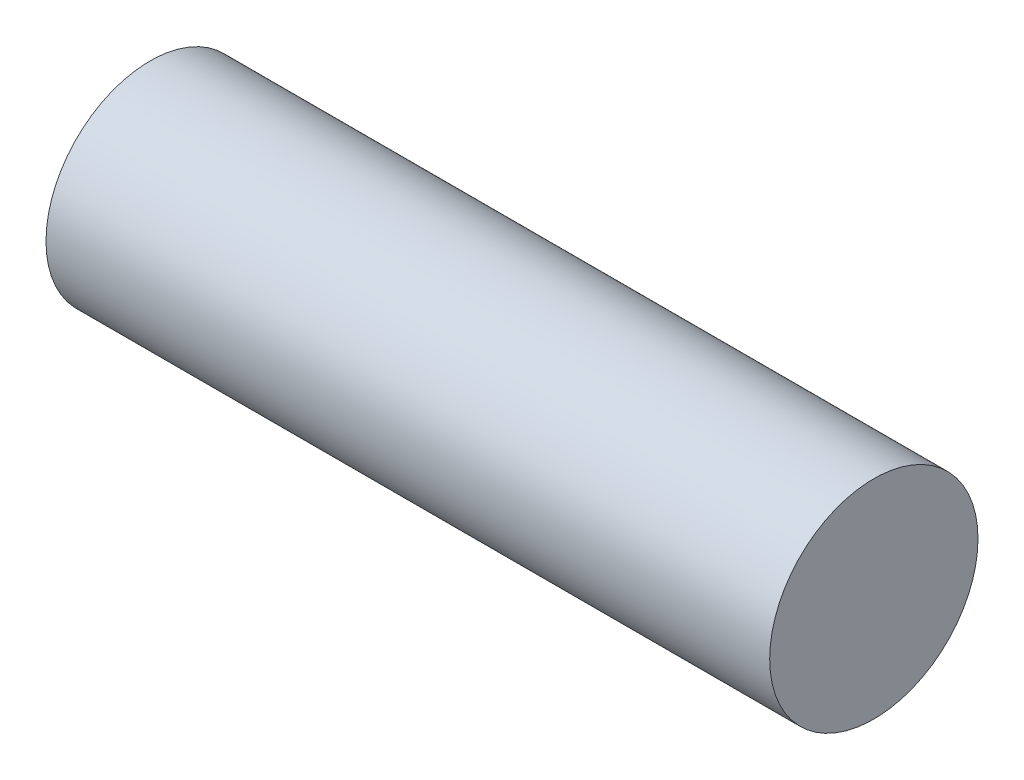
ISO-10303-21;
HEADER;
FILE_DESCRIPTION(('STEP AP214'),'2;1');
FILE_NAME('part.step','',(''),(''),'','','');
FILE_SCHEMA(('AUTOMOTIVE_DESIGN { 1 0 10303 214 1 1 1 1 }'));
ENDSEC;
DATA;
#1=APPLICATION_CONTEXT('core data for automotive mechanical design processes');
#2=APPLICATION_PROTOCOL_DEFINITION('international standard','automotive_design',2000,#1);
#3=PRODUCT_CONTEXT('',#1,'mechanical');
#4=PRODUCT('Part','Part','',(#3));
#5=PRODUCT_RELATED_PRODUCT_CATEGORY('part','',(#4));
#6=PRODUCT_DEFINITION_FORMATION('','',#4);
#7=PRODUCT_DEFINITION_CONTEXT('part definition',#1,'design');
#8=PRODUCT_DEFINITION('design','',#6,#7);
#9=PRODUCT_DEFINITION_SHAPE('','',#8);
#10=(LENGTH_UNIT() NAMED_UNIT(*) SI_UNIT(.MILLI.,.METRE.));
#11=(NAMED_UNIT(*) PLANE_ANGLE_UNIT() SI_UNIT($,.RADIAN.));
#12=(NAMED_UNIT(*) SI_UNIT($,.STERADIAN.) SOLID_ANGLE_UNIT());
#13=UNCERTAINTY_MEASURE_WITH_UNIT(LENGTH_MEASURE(1.E-05),#10,'distance_accuracy_value','');
#14=(GEOMETRIC_REPRESENTATION_CONTEXT(3) GLOBAL_UNCERTAINTY_ASSIGNED_CONTEXT((#13)) GLOBAL_UNIT_ASSIGNED_CONTEXT((#10,
#11,#12)) REPRESENTATION_CONTEXT('',''));
#15=CARTESIAN_POINT('',(0.,0.,0.));
#16=DIRECTION('',(0.,0.,1.));
#17=DIRECTION('',(1.,0.,0.));
#18=AXIS2_PLACEMENT_3D('',#15,#16,#17);
#19=CARTESIAN_POINT('',(66.,0.,0.));
#20=DIRECTION('',(-1.,0.,0.));
#21=DIRECTION('',(0.,0.,1.));
#22=AXIS2_PLACEMENT_3D('',#19,#20,#21);
#23=CYLINDRICAL_SURFACE('',#22,9.5);
#24=CARTESIAN_POINT('',(66.,0.,0.));
#25=DIRECTION('',(1.,0.,0.));
#26=DIRECTION('',(0.,0.,-1.));
#27=AXIS2_PLACEMENT_3D('',#24,#25,#26);
#28=CIRCLE('',#27,9.5);
#29=CARTESIAN_POINT('',(66.,0.,-9.5));
#30=VERTEX_POINT('',#29);
#31=EDGE_CURVE('E10',#30,#30,#28,.T.);
#32=ORIENTED_EDGE('',*,*,#31,.F.);
#33=EDGE_LOOP('',(#32));
#34=FACE_BOUND('',#33,.T.);
#35=CARTESIAN_POINT('',(0.,0.,0.));
#36=DIRECTION('',(1.,0.,0.));
#37=DIRECTION('',(0.,0.,-1.));
#38=AXIS2_PLACEMENT_3D('',#35,#36,#37);
#39=CIRCLE('',#38,9.5);
#40=CARTESIAN_POINT('',(0.,0.,-9.5));
#41=VERTEX_POINT('',#40);
#42=EDGE_CURVE('E40',#41,#41,#39,.T.);
#43=ORIENTED_EDGE('',*,*,#42,.T.);
#44=EDGE_LOOP('',(#43));
#45=FACE_BOUND('',#44,.T.);
#46=ADVANCED_FACE('F37',(#34,#45),#23,.T.);
#47=CARTESIAN_POINT('',(66.,0.,0.));
#48=DIRECTION('',(1.,0.,0.));
#49=DIRECTION('',(0.,0.,-1.));
#50=AXIS2_PLACEMENT_3D('',#47,#48,#49);
#51=PLANE('',#50);
#52=ORIENTED_EDGE('',*,*,#31,.T.);
#53=EDGE_LOOP('',(#52));
#54=FACE_BOUND('',#53,.T.);
#55=ADVANCED_FACE('F54',(#54),#51,.T.);
#56=CARTESIAN_POINT('',(0.,0.,0.));
#57=DIRECTION('',(1.,0.,0.));
#58=DIRECTION('',(0.,0.,-1.));
#59=AXIS2_PLACEMENT_3D('',#56,#57,#58);
#60=PLANE('',#59);
#61=ORIENTED_EDGE('',*,*,#42,.F.);
#62=EDGE_LOOP('',(#61));
#63=FACE_BOUND('',#62,.T.);
#64=ADVANCED_FACE('F52',(#63),#60,.F.);
#65=CLOSED_SHELL('',(#46,#55,#64));
#66=MANIFOLD_SOLID_BREP('B2',#65);
#67=ADVANCED_BREP_SHAPE_REPRESENTATION('',(#18,#66),#14);
#68=SHAPE_DEFINITION_REPRESENTATION(#9,#67);
ENDSEC;
END-ISO-10303-21;
